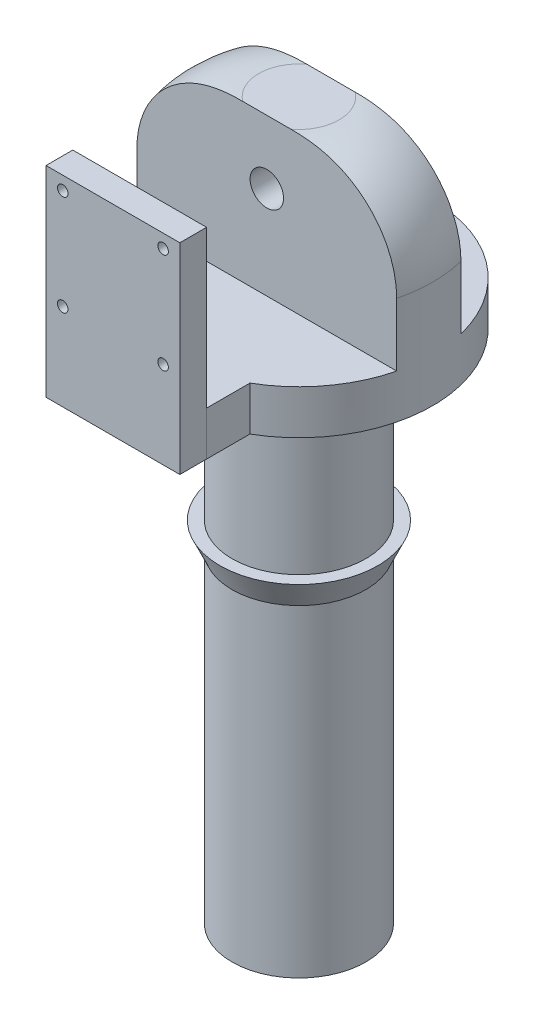
ISO-10303-21;
HEADER;
FILE_DESCRIPTION(('STEP AP214'),'2;1');
FILE_NAME('part.step','',(''),(''),'','','');
FILE_SCHEMA(('AUTOMOTIVE_DESIGN { 1 0 10303 214 1 1 1 1 }'));
ENDSEC;
DATA;
#1=APPLICATION_CONTEXT('core data for automotive mechanical design processes');
#2=APPLICATION_PROTOCOL_DEFINITION('international standard','automotive_design',2000,#1);
#3=PRODUCT_CONTEXT('',#1,'mechanical');
#4=PRODUCT('Part','Part','',(#3));
#5=PRODUCT_RELATED_PRODUCT_CATEGORY('part','',(#4));
#6=PRODUCT_DEFINITION_FORMATION('','',#4);
#7=PRODUCT_DEFINITION_CONTEXT('part definition',#1,'design');
#8=PRODUCT_DEFINITION('design','',#6,#7);
#9=PRODUCT_DEFINITION_SHAPE('','',#8);
#10=(LENGTH_UNIT() NAMED_UNIT(*) SI_UNIT(.MILLI.,.METRE.));
#11=(NAMED_UNIT(*) PLANE_ANGLE_UNIT() SI_UNIT($,.RADIAN.));
#12=(NAMED_UNIT(*) SI_UNIT($,.STERADIAN.) SOLID_ANGLE_UNIT());
#13=UNCERTAINTY_MEASURE_WITH_UNIT(LENGTH_MEASURE(1.E-05),#10,'distance_accuracy_value','');
#14=(GEOMETRIC_REPRESENTATION_CONTEXT(3) GLOBAL_UNCERTAINTY_ASSIGNED_CONTEXT((#13)) GLOBAL_UNIT_ASSIGNED_CONTEXT((#10,
#11,#12)) REPRESENTATION_CONTEXT('',''));
#15=CARTESIAN_POINT('',(0.,0.,0.));
#16=DIRECTION('',(0.,0.,1.));
#17=DIRECTION('',(1.,0.,0.));
#18=AXIS2_PLACEMENT_3D('',#15,#16,#17);
#19=CARTESIAN_POINT('',(8.66583083148983,71.8869808709486,30.226));
#20=DIRECTION('',(0.,0.,-1.));
#21=DIRECTION('',(-1.,0.,0.));
#22=AXIS2_PLACEMENT_3D('',#19,#20,#21);
#23=PLANE('',#22);
#24=CARTESIAN_POINT('',(9.525,133.35,30.226));
#25=DIRECTION('',(0.,0.,-1.));
#26=DIRECTION('',(-1.,0.,0.));
#27=AXIS2_PLACEMENT_3D('',#24,#25,#26);
#28=CIRCLE('',#27,1.);
#29=CARTESIAN_POINT('',(8.525,133.35,30.226));
#30=VERTEX_POINT('',#29);
#31=EDGE_CURVE('E140',#30,#30,#28,.T.);
#32=ORIENTED_EDGE('',*,*,#31,.F.);
#33=EDGE_LOOP('',(#32));
#34=FACE_BOUND('',#33,.T.);
#35=CARTESIAN_POINT('',(-9.525,114.3,30.226));
#36=DIRECTION('',(0.,0.,-1.));
#37=DIRECTION('',(-1.,0.,0.));
#38=AXIS2_PLACEMENT_3D('',#35,#36,#37);
#39=CIRCLE('',#38,1.);
#40=CARTESIAN_POINT('',(-10.525,114.3,30.226));
#41=VERTEX_POINT('',#40);
#42=EDGE_CURVE('E138',#41,#41,#39,.T.);
#43=ORIENTED_EDGE('',*,*,#42,.F.);
#44=EDGE_LOOP('',(#43));
#45=FACE_BOUND('',#44,.T.);
#46=CARTESIAN_POINT('',(-9.525,133.35,30.226));
#47=DIRECTION('',(0.,0.,-1.));
#48=DIRECTION('',(-1.,0.,0.));
#49=AXIS2_PLACEMENT_3D('',#46,#47,#48);
#50=CIRCLE('',#49,1.);
#51=CARTESIAN_POINT('',(-10.525,133.35,30.226));
#52=VERTEX_POINT('',#51);
#53=EDGE_CURVE('E148',#52,#52,#50,.T.);
#54=ORIENTED_EDGE('',*,*,#53,.F.);
#55=EDGE_LOOP('',(#54));
#56=FACE_BOUND('',#55,.T.);
#57=CARTESIAN_POINT('',(9.525,114.3,30.226));
#58=DIRECTION('',(0.,0.,-1.));
#59=DIRECTION('',(-1.,0.,0.));
#60=AXIS2_PLACEMENT_3D('',#57,#58,#59);
#61=CIRCLE('',#60,1.);
#62=CARTESIAN_POINT('',(8.525,114.3,30.226));
#63=VERTEX_POINT('',#62);
#64=EDGE_CURVE('E117',#63,#63,#61,.T.);
#65=ORIENTED_EDGE('',*,*,#64,.F.);
#66=EDGE_LOOP('',(#65));
#67=FACE_BOUND('',#66,.T.);
#68=DIRECTION('',(1.,0.,0.));
#69=VECTOR('',#68,1.);
#70=CARTESIAN_POINT('',(8.66583083148983,97.79,30.226));
#71=LINE('',#70,#69);
#72=CARTESIAN_POINT('',(-12.7,97.79,30.226));
#73=VERTEX_POINT('',#72);
#74=CARTESIAN_POINT('',(12.7,97.79,30.226));
#75=VERTEX_POINT('',#74);
#76=EDGE_CURVE('E67',#73,#75,#71,.T.);
#77=ORIENTED_EDGE('',*,*,#76,.F.);
#78=DIRECTION('',(0.,1.,0.));
#79=VECTOR('',#78,1.);
#80=CARTESIAN_POINT('',(-12.7,71.8869808709486,30.226));
#81=LINE('',#80,#79);
#82=CARTESIAN_POINT('',(-12.7,135.89,30.226));
#83=VERTEX_POINT('',#82);
#84=EDGE_CURVE('E93',#73,#83,#81,.T.);
#85=ORIENTED_EDGE('',*,*,#84,.T.);
#86=DIRECTION('',(-1.,0.,0.));
#87=VECTOR('',#86,1.);
#88=CARTESIAN_POINT('',(8.66583083148983,135.89,30.226));
#89=LINE('',#88,#87);
#90=CARTESIAN_POINT('',(12.7,135.89,30.226));
#91=VERTEX_POINT('',#90);
#92=EDGE_CURVE('E97',#91,#83,#89,.T.);
#93=ORIENTED_EDGE('',*,*,#92,.F.);
#94=DIRECTION('',(0.,1.,0.));
#95=VECTOR('',#94,1.);
#96=CARTESIAN_POINT('',(12.7,71.8869808709486,30.226));
#97=LINE('',#96,#95);
#98=EDGE_CURVE('E121',#75,#91,#97,.T.);
#99=ORIENTED_EDGE('',*,*,#98,.F.);
#100=EDGE_LOOP('',(#77,#85,#93,#99));
#101=FACE_BOUND('',#100,.T.);
#102=ADVANCED_FACE('F60',(#34,#45,#56,#67,#101),#23,.T.);
#103=CARTESIAN_POINT('',(12.7,71.8869808709486,30.226));
#104=DIRECTION('',(1.,0.,0.));
#105=DIRECTION('',(0.,0.,-1.));
#106=AXIS2_PLACEMENT_3D('',#103,#104,#105);
#107=PLANE('',#106);
#108=DIRECTION('',(0.,0.,1.));
#109=VECTOR('',#108,1.);
#110=CARTESIAN_POINT('',(12.7,97.79,30.226));
#111=LINE('',#110,#109);
#112=CARTESIAN_POINT('',(12.7,97.79,35.306));
#113=VERTEX_POINT('',#112);
#114=EDGE_CURVE('E71',#75,#113,#111,.T.);
#115=ORIENTED_EDGE('',*,*,#114,.F.);
#116=ORIENTED_EDGE('',*,*,#98,.T.);
#117=DIRECTION('',(0.,0.,-1.));
#118=VECTOR('',#117,1.);
#119=CARTESIAN_POINT('',(12.7,135.89,30.226));
#120=LINE('',#119,#118);
#121=CARTESIAN_POINT('',(12.7,135.89,35.306));
#122=VERTEX_POINT('',#121);
#123=EDGE_CURVE('E107',#122,#91,#120,.T.);
#124=ORIENTED_EDGE('',*,*,#123,.F.);
#125=DIRECTION('',(0.,1.,0.));
#126=VECTOR('',#125,1.);
#127=CARTESIAN_POINT('',(12.7,71.8869808709486,35.306));
#128=LINE('',#127,#126);
#129=EDGE_CURVE('E130',#113,#122,#128,.T.);
#130=ORIENTED_EDGE('',*,*,#129,.F.);
#131=EDGE_LOOP('',(#115,#116,#124,#130));
#132=FACE_BOUND('',#131,.T.);
#133=ADVANCED_FACE('F134',(#132),#107,.T.);
#134=CARTESIAN_POINT('',(12.7,71.8869808709486,35.306));
#135=DIRECTION('',(0.,0.,1.));
#136=DIRECTION('',(1.,0.,0.));
#137=AXIS2_PLACEMENT_3D('',#134,#135,#136);
#138=PLANE('',#137);
#139=CARTESIAN_POINT('',(9.525,133.35,35.306));
#140=DIRECTION('',(0.,0.,1.));
#141=DIRECTION('',(1.,0.,0.));
#142=AXIS2_PLACEMENT_3D('',#139,#140,#141);
#143=CIRCLE('',#142,1.);
#144=CARTESIAN_POINT('',(10.525,133.35,35.306));
#145=VERTEX_POINT('',#144);
#146=EDGE_CURVE('E145',#145,#145,#143,.F.);
#147=ORIENTED_EDGE('',*,*,#146,.T.);
#148=EDGE_LOOP('',(#147));
#149=FACE_BOUND('',#148,.T.);
#150=CARTESIAN_POINT('',(-9.525,114.3,35.306));
#151=DIRECTION('',(0.,0.,1.));
#152=DIRECTION('',(1.,0.,0.));
#153=AXIS2_PLACEMENT_3D('',#150,#151,#152);
#154=CIRCLE('',#153,1.);
#155=CARTESIAN_POINT('',(-8.525,114.3,35.306));
#156=VERTEX_POINT('',#155);
#157=EDGE_CURVE('E141',#156,#156,#154,.F.);
#158=ORIENTED_EDGE('',*,*,#157,.T.);
#159=EDGE_LOOP('',(#158));
#160=FACE_BOUND('',#159,.T.);
#161=CARTESIAN_POINT('',(-9.525,133.35,35.306));
#162=DIRECTION('',(0.,0.,1.));
#163=DIRECTION('',(1.,0.,0.));
#164=AXIS2_PLACEMENT_3D('',#161,#162,#163);
#165=CIRCLE('',#164,1.);
#166=CARTESIAN_POINT('',(-8.525,133.35,35.306));
#167=VERTEX_POINT('',#166);
#168=EDGE_CURVE('E154',#167,#167,#165,.F.);
#169=ORIENTED_EDGE('',*,*,#168,.T.);
#170=EDGE_LOOP('',(#169));
#171=FACE_BOUND('',#170,.T.);
#172=CARTESIAN_POINT('',(9.525,114.3,35.306));
#173=DIRECTION('',(0.,0.,1.));
#174=DIRECTION('',(1.,0.,0.));
#175=AXIS2_PLACEMENT_3D('',#172,#173,#174);
#176=CIRCLE('',#175,1.);
#177=CARTESIAN_POINT('',(10.525,114.3,35.306));
#178=VERTEX_POINT('',#177);
#179=EDGE_CURVE('E112',#178,#178,#176,.F.);
#180=ORIENTED_EDGE('',*,*,#179,.T.);
#181=EDGE_LOOP('',(#180));
#182=FACE_BOUND('',#181,.T.);
#183=DIRECTION('',(-1.,0.,0.));
#184=VECTOR('',#183,1.);
#185=CARTESIAN_POINT('',(12.7,97.79,35.306));
#186=LINE('',#185,#184);
#187=CARTESIAN_POINT('',(-12.7,97.79,35.306));
#188=VERTEX_POINT('',#187);
#189=EDGE_CURVE('E128',#113,#188,#186,.T.);
#190=ORIENTED_EDGE('',*,*,#189,.F.);
#191=ORIENTED_EDGE('',*,*,#129,.T.);
#192=DIRECTION('',(1.,0.,0.));
#193=VECTOR('',#192,1.);
#194=CARTESIAN_POINT('',(12.7,135.89,35.306));
#195=LINE('',#194,#193);
#196=CARTESIAN_POINT('',(-12.7,135.89,35.306));
#197=VERTEX_POINT('',#196);
#198=EDGE_CURVE('E113',#197,#122,#195,.T.);
#199=ORIENTED_EDGE('',*,*,#198,.F.);
#200=DIRECTION('',(0.,1.,0.));
#201=VECTOR('',#200,1.);
#202=CARTESIAN_POINT('',(-12.7,71.8869808709486,35.306));
#203=LINE('',#202,#201);
#204=EDGE_CURVE('E103',#188,#197,#203,.T.);
#205=ORIENTED_EDGE('',*,*,#204,.F.);
#206=EDGE_LOOP('',(#190,#191,#199,#205));
#207=FACE_BOUND('',#206,.T.);
#208=ADVANCED_FACE('F132',(#149,#160,#171,#182,#207),#138,.T.);
#209=CARTESIAN_POINT('',(-12.7,71.8869808709486,35.306));
#210=DIRECTION('',(-1.,0.,0.));
#211=DIRECTION('',(0.,0.,1.));
#212=AXIS2_PLACEMENT_3D('',#209,#210,#211);
#213=PLANE('',#212);
#214=DIRECTION('',(0.,0.,-1.));
#215=VECTOR('',#214,1.);
#216=CARTESIAN_POINT('',(-12.7,97.79,35.306));
#217=LINE('',#216,#215);
#218=EDGE_CURVE('E12',#188,#73,#217,.T.);
#219=ORIENTED_EDGE('',*,*,#218,.F.);
#220=ORIENTED_EDGE('',*,*,#204,.T.);
#221=DIRECTION('',(0.,0.,1.));
#222=VECTOR('',#221,1.);
#223=CARTESIAN_POINT('',(-12.7,135.89,35.306));
#224=LINE('',#223,#222);
#225=EDGE_CURVE('E110',#83,#197,#224,.T.);
#226=ORIENTED_EDGE('',*,*,#225,.F.);
#227=ORIENTED_EDGE('',*,*,#84,.F.);
#228=EDGE_LOOP('',(#219,#220,#226,#227));
#229=FACE_BOUND('',#228,.T.);
#230=ADVANCED_FACE('F56',(#229),#213,.T.);
#231=CARTESIAN_POINT('',(0.,135.89,0.));
#232=DIRECTION('',(0.,-1.,0.));
#233=DIRECTION('',(0.,0.,-1.));
#234=AXIS2_PLACEMENT_3D('',#231,#232,#233);
#235=PLANE('',#234);
#236=ORIENTED_EDGE('',*,*,#92,.T.);
#237=ORIENTED_EDGE('',*,*,#225,.T.);
#238=ORIENTED_EDGE('',*,*,#198,.T.);
#239=ORIENTED_EDGE('',*,*,#123,.T.);
#240=EDGE_LOOP('',(#236,#237,#238,#239));
#241=FACE_BOUND('',#240,.T.);
#242=ADVANCED_FACE('F102',(#241),#235,.F.);
#243=CARTESIAN_POINT('',(0.,97.79,0.));
#244=DIRECTION('',(0.,1.,0.));
#245=DIRECTION('',(0.,0.,1.));
#246=AXIS2_PLACEMENT_3D('',#243,#244,#245);
#247=PLANE('',#246);
#248=ORIENTED_EDGE('',*,*,#76,.T.);
#249=ORIENTED_EDGE('',*,*,#114,.T.);
#250=ORIENTED_EDGE('',*,*,#189,.T.);
#251=ORIENTED_EDGE('',*,*,#218,.T.);
#252=EDGE_LOOP('',(#248,#249,#250,#251));
#253=FACE_BOUND('',#252,.T.);
#254=ADVANCED_FACE('F175',(#253),#247,.F.);
#255=CARTESIAN_POINT('',(9.525,114.3,38.1344271247462));
#256=DIRECTION('',(0.,0.,-1.));
#257=DIRECTION('',(-1.,0.,0.));
#258=AXIS2_PLACEMENT_3D('',#255,#256,#257);
#259=CYLINDRICAL_SURFACE('',#258,1.);
#260=ORIENTED_EDGE('',*,*,#64,.T.);
#261=EDGE_LOOP('',(#260));
#262=FACE_BOUND('',#261,.T.);
#263=ORIENTED_EDGE('',*,*,#179,.F.);
#264=EDGE_LOOP('',(#263));
#265=FACE_BOUND('',#264,.T.);
#266=ADVANCED_FACE('F162',(#262,#265),#259,.F.);
#267=CARTESIAN_POINT('',(-9.525,133.35,38.1344271247462));
#268=DIRECTION('',(0.,0.,-1.));
#269=DIRECTION('',(-1.,0.,0.));
#270=AXIS2_PLACEMENT_3D('',#267,#268,#269);
#271=CYLINDRICAL_SURFACE('',#270,1.);
#272=ORIENTED_EDGE('',*,*,#53,.T.);
#273=EDGE_LOOP('',(#272));
#274=FACE_BOUND('',#273,.T.);
#275=ORIENTED_EDGE('',*,*,#168,.F.);
#276=EDGE_LOOP('',(#275));
#277=FACE_BOUND('',#276,.T.);
#278=ADVANCED_FACE('F158',(#274,#277),#271,.F.);
#279=CARTESIAN_POINT('',(-9.525,114.3,38.1344271247462));
#280=DIRECTION('',(0.,0.,-1.));
#281=DIRECTION('',(-1.,0.,0.));
#282=AXIS2_PLACEMENT_3D('',#279,#280,#281);
#283=CYLINDRICAL_SURFACE('',#282,1.);
#284=ORIENTED_EDGE('',*,*,#42,.T.);
#285=EDGE_LOOP('',(#284));
#286=FACE_BOUND('',#285,.T.);
#287=ORIENTED_EDGE('',*,*,#157,.F.);
#288=EDGE_LOOP('',(#287));
#289=FACE_BOUND('',#288,.T.);
#290=ADVANCED_FACE('F163',(#286,#289),#283,.F.);
#291=CARTESIAN_POINT('',(9.525,133.35,38.1344271247462));
#292=DIRECTION('',(0.,0.,-1.));
#293=DIRECTION('',(-1.,0.,0.));
#294=AXIS2_PLACEMENT_3D('',#291,#292,#293);
#295=CYLINDRICAL_SURFACE('',#294,1.);
#296=ORIENTED_EDGE('',*,*,#31,.T.);
#297=EDGE_LOOP('',(#296));
#298=FACE_BOUND('',#297,.T.);
#299=ORIENTED_EDGE('',*,*,#146,.F.);
#300=EDGE_LOOP('',(#299));
#301=FACE_BOUND('',#300,.T.);
#302=ADVANCED_FACE('F169',(#298,#301),#295,.F.);
#303=CLOSED_SHELL('',(#102,#133,#208,#230,#242,#254,#266,#278,#290,#302));
#304=MANIFOLD_SOLID_BREP('B2',#303);
#305=CARTESIAN_POINT('',(0.,135.89,0.));
#306=DIRECTION('',(0.,-1.,0.));
#307=DIRECTION('',(0.,0.,-1.));
#308=AXIS2_PLACEMENT_3D('',#305,#306,#307);
#309=CYLINDRICAL_SURFACE('',#308,25.4);
#310=CARTESIAN_POINT('',(0.,97.79,0.));
#311=DIRECTION('',(0.,1.,0.));
#312=DIRECTION('',(0.,0.,1.));
#313=AXIS2_PLACEMENT_3D('',#310,#311,#312);
#314=CIRCLE('',#313,25.4);
#315=CARTESIAN_POINT('',(12.7,97.79,21.9970452561247));
#316=VERTEX_POINT('',#315);
#317=CARTESIAN_POINT('',(-12.7,97.79,21.9970452561247));
#318=VERTEX_POINT('',#317);
#319=EDGE_CURVE('E291',#316,#318,#314,.T.);
#320=ORIENTED_EDGE('',*,*,#319,.T.);
#321=DIRECTION('',(0.,1.,0.));
#322=VECTOR('',#321,1.);
#323=CARTESIAN_POINT('',(-12.7,71.0902678632023,21.9970452561247));
#324=LINE('',#323,#322);
#325=CARTESIAN_POINT('',(-12.7,106.172,21.9970452561247));
#326=VERTEX_POINT('',#325);
#327=EDGE_CURVE('E369',#318,#326,#324,.T.);
#328=ORIENTED_EDGE('',*,*,#327,.T.);
#329=CARTESIAN_POINT('',(0.,106.172,0.));
#330=DIRECTION('',(0.,-1.,0.));
#331=DIRECTION('',(0.,0.,-1.));
#332=AXIS2_PLACEMENT_3D('',#329,#330,#331);
#333=CIRCLE('',#332,25.4);
#334=CARTESIAN_POINT('',(-24.6576313542076,106.172,6.096));
#335=VERTEX_POINT('',#334);
#336=EDGE_CURVE('E360',#326,#335,#333,.T.);
#337=ORIENTED_EDGE('',*,*,#336,.T.);
#338=DIRECTION('',(0.,-1.,0.));
#339=VECTOR('',#338,1.);
#340=CARTESIAN_POINT('',(-24.6576313542076,135.89,6.096));
#341=LINE('',#340,#339);
#342=CARTESIAN_POINT('',(-24.6576313542076,118.11,6.096));
#343=VERTEX_POINT('',#342);
#344=EDGE_CURVE('E425',#343,#335,#341,.T.);
#345=ORIENTED_EDGE('',*,*,#344,.F.);
#346=CARTESIAN_POINT('',(0.,118.11,0.));
#347=DIRECTION('',(0.,1.,0.));
#348=DIRECTION('',(0.,0.,1.));
#349=AXIS2_PLACEMENT_3D('',#346,#347,#348);
#350=CIRCLE('',#349,25.4);
#351=CARTESIAN_POINT('',(-24.6576313542076,118.11,-6.096));
#352=VERTEX_POINT('',#351);
#353=EDGE_CURVE('E533',#343,#352,#350,.F.);
#354=ORIENTED_EDGE('',*,*,#353,.T.);
#355=DIRECTION('',(0.,-1.,0.));
#356=VECTOR('',#355,1.);
#357=CARTESIAN_POINT('',(-24.6576313542076,135.89,-6.096));
#358=LINE('',#357,#356);
#359=CARTESIAN_POINT('',(-24.6576313542076,106.172,-6.096));
#360=VERTEX_POINT('',#359);
#361=EDGE_CURVE('E435',#352,#360,#358,.T.);
#362=ORIENTED_EDGE('',*,*,#361,.T.);
#363=CARTESIAN_POINT('',(0.,106.172,0.));
#364=DIRECTION('',(0.,1.,0.));
#365=DIRECTION('',(0.,0.,1.));
#366=AXIS2_PLACEMENT_3D('',#363,#364,#365);
#367=CIRCLE('',#366,25.4);
#368=CARTESIAN_POINT('',(24.6576313542076,106.172,-6.096));
#369=VERTEX_POINT('',#368);
#370=EDGE_CURVE('E356',#369,#360,#367,.T.);
#371=ORIENTED_EDGE('',*,*,#370,.F.);
#372=DIRECTION('',(0.,-1.,0.));
#373=VECTOR('',#372,1.);
#374=CARTESIAN_POINT('',(24.6576313542076,135.89,-6.096));
#375=LINE('',#374,#373);
#376=CARTESIAN_POINT('',(24.6576313542076,118.11,-6.096));
#377=VERTEX_POINT('',#376);
#378=EDGE_CURVE('E426',#369,#377,#375,.F.);
#379=ORIENTED_EDGE('',*,*,#378,.T.);
#380=CARTESIAN_POINT('',(0.,118.11,0.));
#381=DIRECTION('',(0.,1.,0.));
#382=DIRECTION('',(0.,0.,1.));
#383=AXIS2_PLACEMENT_3D('',#380,#381,#382);
#384=CIRCLE('',#383,25.4);
#385=CARTESIAN_POINT('',(24.6576313542076,118.11,6.096));
#386=VERTEX_POINT('',#385);
#387=EDGE_CURVE('E541',#377,#386,#384,.F.);
#388=ORIENTED_EDGE('',*,*,#387,.T.);
#389=DIRECTION('',(0.,-1.,0.));
#390=VECTOR('',#389,1.);
#391=CARTESIAN_POINT('',(24.6576313542076,135.89,6.096));
#392=LINE('',#391,#390);
#393=CARTESIAN_POINT('',(24.6576313542076,106.172,6.096));
#394=VERTEX_POINT('',#393);
#395=EDGE_CURVE('E351',#394,#386,#392,.F.);
#396=ORIENTED_EDGE('',*,*,#395,.F.);
#397=CARTESIAN_POINT('',(12.7,106.172,21.9970452561247));
#398=VERTEX_POINT('',#397);
#399=EDGE_CURVE('E348',#394,#398,#333,.T.);
#400=ORIENTED_EDGE('',*,*,#399,.T.);
#401=DIRECTION('',(0.,1.,0.));
#402=VECTOR('',#401,1.);
#403=CARTESIAN_POINT('',(12.7,71.0902678632023,21.9970452561247));
#404=LINE('',#403,#402);
#405=EDGE_CURVE('E296',#316,#398,#404,.T.);
#406=ORIENTED_EDGE('',*,*,#405,.F.);
#407=EDGE_LOOP('',(#320,#328,#337,#345,#354,#362,#371,#379,#388,#396,#400,#406));
#408=FACE_BOUND('',#407,.T.);
#409=ADVANCED_FACE('F272',(#408),#309,.T.);
#410=CARTESIAN_POINT('',(0.,135.89,0.));
#411=DIRECTION('',(0.,1.,0.));
#412=DIRECTION('',(0.,0.,1.));
#413=AXIS2_PLACEMENT_3D('',#410,#411,#412);
#414=PLANE('',#413);
#415=DIRECTION('',(1.,0.,0.));
#416=VECTOR('',#415,1.);
#417=CARTESIAN_POINT('',(-25.4,135.89,-6.096));
#418=LINE('',#417,#416);
#419=CARTESIAN_POINT('',(-4.572,135.89,-6.096));
#420=VERTEX_POINT('',#419);
#421=CARTESIAN_POINT('',(4.572,135.89,-6.096));
#422=VERTEX_POINT('',#421);
#423=EDGE_CURVE('E412',#420,#422,#418,.T.);
#424=ORIENTED_EDGE('',*,*,#423,.F.);
#425=CARTESIAN_POINT('',(0.,135.89,0.));
#426=DIRECTION('',(0.,1.,0.));
#427=DIRECTION('',(0.,0.,1.));
#428=AXIS2_PLACEMENT_3D('',#425,#426,#427);
#429=CIRCLE('',#428,7.62);
#430=CARTESIAN_POINT('',(-4.572,135.89,6.096));
#431=VERTEX_POINT('',#430);
#432=EDGE_CURVE('E465',#420,#431,#429,.T.);
#433=ORIENTED_EDGE('',*,*,#432,.T.);
#434=DIRECTION('',(1.,0.,0.));
#435=VECTOR('',#434,1.);
#436=CARTESIAN_POINT('',(-25.4,135.89,6.096));
#437=LINE('',#436,#435);
#438=CARTESIAN_POINT('',(4.572,135.89,6.096));
#439=VERTEX_POINT('',#438);
#440=EDGE_CURVE('E413',#431,#439,#437,.T.);
#441=ORIENTED_EDGE('',*,*,#440,.T.);
#442=CARTESIAN_POINT('',(0.,135.89,0.));
#443=DIRECTION('',(0.,1.,0.));
#444=DIRECTION('',(0.,0.,1.));
#445=AXIS2_PLACEMENT_3D('',#442,#443,#444);
#446=CIRCLE('',#445,7.62);
#447=EDGE_CURVE('E456',#439,#422,#446,.T.);
#448=ORIENTED_EDGE('',*,*,#447,.T.);
#449=EDGE_LOOP('',(#424,#433,#441,#448));
#450=FACE_BOUND('',#449,.T.);
#451=ADVANCED_FACE('F490',(#450),#414,.T.);
#452=CARTESIAN_POINT('',(0.,97.79,0.));
#453=DIRECTION('',(0.,-1.,0.));
#454=DIRECTION('',(0.,0.,-1.));
#455=AXIS2_PLACEMENT_3D('',#452,#453,#454);
#456=CYLINDRICAL_SURFACE('',#455,12.7);
#457=CARTESIAN_POINT('',(0.,61.214,0.));
#458=DIRECTION('',(0.,1.,0.));
#459=DIRECTION('',(0.,0.,1.));
#460=AXIS2_PLACEMENT_3D('',#457,#458,#459);
#461=CIRCLE('',#460,12.7);
#462=CARTESIAN_POINT('',(0.,61.214,12.7));
#463=VERTEX_POINT('',#462);
#464=EDGE_CURVE('E444',#463,#463,#461,.T.);
#465=ORIENTED_EDGE('',*,*,#464,.F.);
#466=EDGE_LOOP('',(#465));
#467=FACE_BOUND('',#466,.T.);
#468=CARTESIAN_POINT('',(0.,0.,0.));
#469=DIRECTION('',(0.,1.,0.));
#470=DIRECTION('',(0.,0.,1.));
#471=AXIS2_PLACEMENT_3D('',#468,#469,#470);
#472=CIRCLE('',#471,12.7);
#473=CARTESIAN_POINT('',(0.,0.,12.7));
#474=VERTEX_POINT('',#473);
#475=EDGE_CURVE('E446',#474,#474,#472,.T.);
#476=ORIENTED_EDGE('',*,*,#475,.T.);
#477=EDGE_LOOP('',(#476));
#478=FACE_BOUND('',#477,.T.);
#479=ADVANCED_FACE('F491',(#467,#478),#456,.T.);
#480=CARTESIAN_POINT('',(0.,0.,0.));
#481=DIRECTION('',(0.,1.,0.));
#482=DIRECTION('',(0.,0.,1.));
#483=AXIS2_PLACEMENT_3D('',#480,#481,#482);
#484=PLANE('',#483);
#485=ORIENTED_EDGE('',*,*,#475,.F.);
#486=EDGE_LOOP('',(#485));
#487=FACE_BOUND('',#486,.T.);
#488=ADVANCED_FACE('F508',(#487),#484,.F.);
#489=CARTESIAN_POINT('',(0.,66.294,0.));
#490=DIRECTION('',(0.,1.,0.));
#491=DIRECTION('',(0.,0.,1.));
#492=AXIS2_PLACEMENT_3D('',#489,#490,#491);
#493=CONICAL_SURFACE('',#492,14.986,0.42285392613294);
#494=ORIENTED_EDGE('',*,*,#464,.T.);
#495=EDGE_LOOP('',(#494));
#496=FACE_BOUND('',#495,.T.);
#497=CARTESIAN_POINT('',(0.,66.294,0.));
#498=DIRECTION('',(0.,1.,0.));
#499=DIRECTION('',(0.,0.,1.));
#500=AXIS2_PLACEMENT_3D('',#497,#498,#499);
#501=CIRCLE('',#500,14.986);
#502=CARTESIAN_POINT('',(0.,66.294,14.986));
#503=VERTEX_POINT('',#502);
#504=EDGE_CURVE('E441',#503,#503,#501,.T.);
#505=ORIENTED_EDGE('',*,*,#504,.F.);
#506=EDGE_LOOP('',(#505));
#507=FACE_BOUND('',#506,.T.);
#508=ADVANCED_FACE('F504',(#496,#507),#493,.T.);
#509=CARTESIAN_POINT('',(0.,66.294,0.));
#510=DIRECTION('',(0.,1.,0.));
#511=DIRECTION('',(0.,0.,1.));
#512=AXIS2_PLACEMENT_3D('',#509,#510,#511);
#513=PLANE('',#512);
#514=ORIENTED_EDGE('',*,*,#504,.T.);
#515=EDGE_LOOP('',(#514));
#516=FACE_BOUND('',#515,.T.);
#517=CARTESIAN_POINT('',(0.,66.294,0.));
#518=DIRECTION('',(0.,1.,0.));
#519=DIRECTION('',(0.,0.,1.));
#520=AXIS2_PLACEMENT_3D('',#517,#518,#519);
#521=CIRCLE('',#520,12.7);
#522=CARTESIAN_POINT('',(0.,66.294,12.7));
#523=VERTEX_POINT('',#522);
#524=EDGE_CURVE('E440',#523,#523,#521,.T.);
#525=ORIENTED_EDGE('',*,*,#524,.F.);
#526=EDGE_LOOP('',(#525));
#527=FACE_BOUND('',#526,.T.);
#528=ADVANCED_FACE('F505',(#516,#527),#513,.T.);
#529=ORIENTED_EDGE('',*,*,#524,.T.);
#530=EDGE_LOOP('',(#529));
#531=FACE_BOUND('',#530,.T.);
#532=CARTESIAN_POINT('',(0.,97.79,0.));
#533=DIRECTION('',(0.,1.,0.));
#534=DIRECTION('',(0.,0.,1.));
#535=AXIS2_PLACEMENT_3D('',#532,#533,#534);
#536=CIRCLE('',#535,12.7);
#537=CARTESIAN_POINT('',(0.,97.79,12.7));
#538=VERTEX_POINT('',#537);
#539=EDGE_CURVE('E423',#538,#538,#536,.T.);
#540=ORIENTED_EDGE('',*,*,#539,.F.);
#541=EDGE_LOOP('',(#540));
#542=FACE_BOUND('',#541,.T.);
#543=ADVANCED_FACE('F498',(#531,#542),#456,.T.);
#544=CARTESIAN_POINT('',(0.,97.79,0.));
#545=DIRECTION('',(0.,1.,0.));
#546=DIRECTION('',(0.,0.,1.));
#547=AXIS2_PLACEMENT_3D('',#544,#545,#546);
#548=PLANE('',#547);
#549=ORIENTED_EDGE('',*,*,#539,.T.);
#550=EDGE_LOOP('',(#549));
#551=FACE_BOUND('',#550,.T.);
#552=ORIENTED_EDGE('',*,*,#319,.F.);
#553=DIRECTION('',(0.,0.,1.));
#554=VECTOR('',#553,1.);
#555=CARTESIAN_POINT('',(12.7,97.79,23.876));
#556=LINE('',#555,#554);
#557=CARTESIAN_POINT('',(12.7,97.79,30.226));
#558=VERTEX_POINT('',#557);
#559=EDGE_CURVE('E368',#316,#558,#556,.T.);
#560=ORIENTED_EDGE('',*,*,#559,.T.);
#561=DIRECTION('',(-1.,0.,0.));
#562=VECTOR('',#561,1.);
#563=CARTESIAN_POINT('',(-12.7,97.79,30.226));
#564=LINE('',#563,#562);
#565=CARTESIAN_POINT('',(-12.7,97.79,30.226));
#566=VERTEX_POINT('',#565);
#567=EDGE_CURVE('E385',#558,#566,#564,.T.);
#568=ORIENTED_EDGE('',*,*,#567,.T.);
#569=DIRECTION('',(0.,0.,-1.));
#570=VECTOR('',#569,1.);
#571=CARTESIAN_POINT('',(-12.7,97.79,23.876));
#572=LINE('',#571,#570);
#573=EDGE_CURVE('E387',#566,#318,#572,.T.);
#574=ORIENTED_EDGE('',*,*,#573,.T.);
#575=EDGE_LOOP('',(#552,#560,#568,#574));
#576=FACE_BOUND('',#575,.T.);
#577=ADVANCED_FACE('F492',(#551,#576),#548,.F.);
#578=CARTESIAN_POINT('',(-25.4,106.172,0.));
#579=DIRECTION('',(0.,-1.,0.));
#580=DIRECTION('',(0.,0.,-1.));
#581=AXIS2_PLACEMENT_3D('',#578,#579,#580);
#582=PLANE('',#581);
#583=DIRECTION('',(1.,0.,0.));
#584=VECTOR('',#583,1.);
#585=CARTESIAN_POINT('',(-25.4,106.172,6.096));
#586=LINE('',#585,#584);
#587=EDGE_CURVE('E408',#335,#394,#586,.T.);
#588=ORIENTED_EDGE('',*,*,#587,.F.);
#589=ORIENTED_EDGE('',*,*,#336,.F.);
#590=DIRECTION('',(0.,0.,1.));
#591=VECTOR('',#590,1.);
#592=CARTESIAN_POINT('',(-12.7,106.172,23.876));
#593=LINE('',#592,#591);
#594=CARTESIAN_POINT('',(-12.7,106.172,30.226));
#595=VERTEX_POINT('',#594);
#596=EDGE_CURVE('E380',#326,#595,#593,.T.);
#597=ORIENTED_EDGE('',*,*,#596,.T.);
#598=DIRECTION('',(1.,0.,0.));
#599=VECTOR('',#598,1.);
#600=CARTESIAN_POINT('',(-12.7,106.172,30.226));
#601=LINE('',#600,#599);
#602=CARTESIAN_POINT('',(12.7,106.172,30.226));
#603=VERTEX_POINT('',#602);
#604=EDGE_CURVE('E371',#595,#603,#601,.T.);
#605=ORIENTED_EDGE('',*,*,#604,.T.);
#606=DIRECTION('',(0.,0.,-1.));
#607=VECTOR('',#606,1.);
#608=CARTESIAN_POINT('',(12.7,106.172,23.876));
#609=LINE('',#608,#607);
#610=EDGE_CURVE('E366',#603,#398,#609,.T.);
#611=ORIENTED_EDGE('',*,*,#610,.T.);
#612=ORIENTED_EDGE('',*,*,#399,.F.);
#613=EDGE_LOOP('',(#588,#589,#597,#605,#611,#612));
#614=FACE_BOUND('',#613,.T.);
#615=ADVANCED_FACE('F373',(#614),#582,.F.);
#616=CARTESIAN_POINT('',(-25.4,0.,6.09599999999998));
#617=DIRECTION('',(0.,0.,1.));
#618=DIRECTION('',(0.,-1.,0.));
#619=AXIS2_PLACEMENT_3D('',#616,#617,#618);
#620=PLANE('',#619);
#621=CARTESIAN_POINT('',(0.,123.825,6.096));
#622=DIRECTION('',(0.,0.,1.));
#623=DIRECTION('',(0.,-1.,0.));
#624=AXIS2_PLACEMENT_3D('',#621,#622,#623);
#625=CIRCLE('',#624,3.175);
#626=CARTESIAN_POINT('',(0.,120.65,6.096));
#627=VERTEX_POINT('',#626);
#628=EDGE_CURVE('E405',#627,#627,#625,.F.);
#629=ORIENTED_EDGE('',*,*,#628,.T.);
#630=EDGE_LOOP('',(#629));
#631=FACE_BOUND('',#630,.T.);
#632=ORIENTED_EDGE('',*,*,#440,.F.);
#633=CARTESIAN_POINT('',(-4.572,135.89,6.096));
#634=CARTESIAN_POINT('',(-4.73221962757965,135.890003572415,6.096));
#635=CARTESIAN_POINT('',(-4.89243988172524,135.889219893008,6.096));
#636=CARTESIAN_POINT('',(-5.21286800589376,135.885794035056,6.096));
#637=CARTESIAN_POINT('',(-5.37307587489268,135.883151763309,6.096));
#638=CARTESIAN_POINT('',(-5.85376166317445,135.87200821479,6.096));
#639=CARTESIAN_POINT('',(-6.17417637322918,135.860289756917,6.096));
#640=CARTESIAN_POINT('',(-6.81530914931248,135.826361554901,6.096));
#641=CARTESIAN_POINT('',(-7.13602580192154,135.804124337728,6.096));
#642=CARTESIAN_POINT('',(-7.77637727747322,135.747690206759,6.096));
#643=CARTESIAN_POINT('',(-8.09601224492534,135.71349495979,6.096));
#644=CARTESIAN_POINT('',(-8.73511523138546,135.631839471919,6.096));
#645=CARTESIAN_POINT('',(-9.05457550126635,135.584318035043,6.096));
#646=CARTESIAN_POINT('',(-9.69108901938256,135.475246424286,6.096));
#647=CARTESIAN_POINT('',(-10.0081423695814,135.413696848139,6.096));
#648=CARTESIAN_POINT('',(-10.638752981454,135.276042045905,6.096));
#649=CARTESIAN_POINT('',(-10.952313455149,135.199951606423,6.096));
#650=CARTESIAN_POINT('',(-11.5753843776746,135.032801618653,6.096));
#651=CARTESIAN_POINT('',(-11.8848950953581,134.941743069559,6.096));
#652=CARTESIAN_POINT('',(-12.6842587679039,134.684891367761,6.096));
#653=CARTESIAN_POINT('',(-13.1703363003012,134.507139485877,6.096));
#654=CARTESIAN_POINT('',(-14.1263418474449,134.112301125893,6.096));
#655=CARTESIAN_POINT('',(-14.5962667475511,133.895207111686,6.096));
#656=CARTESIAN_POINT('',(-15.5150216383782,133.422897042977,6.096));
#657=CARTESIAN_POINT('',(-15.9639040852428,133.167783229739,6.096));
#658=CARTESIAN_POINT('',(-16.8382607679193,132.620217020428,6.096));
#659=CARTESIAN_POINT('',(-17.2637365845327,132.327767150343,6.096));
#660=CARTESIAN_POINT('',(-18.0891326119244,131.706252554251,6.096));
#661=CARTESIAN_POINT('',(-18.4889701084489,131.377077869862,6.096));
#662=CARTESIAN_POINT('',(-19.2583462598229,130.685027597066,6.096));
#663=CARTESIAN_POINT('',(-19.6278836894102,130.322150647084,6.096));
#664=CARTESIAN_POINT('',(-20.3339840564899,129.564801718268,6.096));
#665=CARTESIAN_POINT('',(-20.6705122635274,129.170297239008,6.096));
#666=CARTESIAN_POINT('',(-21.1479790519846,128.557493466012,6.096));
#667=CARTESIAN_POINT('',(-21.3025844882526,128.349711358351,6.096));
#668=CARTESIAN_POINT('',(-21.6024514641991,127.927425767712,6.096));
#669=CARTESIAN_POINT('',(-21.7477105134642,127.712920515759,6.096));
#670=CARTESIAN_POINT('',(-22.1570867836563,127.07836282265,6.096));
#671=CARTESIAN_POINT('',(-22.4082991147849,126.649881898516,6.096));
#672=CARTESIAN_POINT('',(-22.873113975252,125.773055623343,6.096));
#673=CARTESIAN_POINT('',(-23.0867171555106,125.32471061627,6.096));
#674=CARTESIAN_POINT('',(-23.4745271015618,124.411757851051,6.096));
#675=CARTESIAN_POINT('',(-23.6487687153836,123.947164901955,6.096));
#676=CARTESIAN_POINT('',(-23.9567024725719,123.004805081354,6.096));
#677=CARTESIAN_POINT('',(-24.0904041739933,122.527041344136,6.096));
#678=CARTESIAN_POINT('',(-24.2787366385902,121.722226739497,6.096));
#679=CARTESIAN_POINT('',(-24.3448806221615,121.397820698095,6.096));
#680=CARTESIAN_POINT('',(-24.4584250240215,120.745749984143,6.096));
#681=CARTESIAN_POINT('',(-24.5058269116111,120.418085569101,6.096));
#682=CARTESIAN_POINT('',(-24.5816767878574,119.760931961043,6.096));
#683=CARTESIAN_POINT('',(-24.6101450710676,119.431445104818,6.096));
#684=CARTESIAN_POINT('',(-24.6481301059606,118.771306963853,6.096));
#685=CARTESIAN_POINT('',(-24.6576426141533,118.440655434979,6.096));
#686=CARTESIAN_POINT('',(-24.6576313542076,118.11,6.096));
#687=B_SPLINE_CURVE_WITH_KNOTS('',3,(#633,#634,#635,#636,#637,#638,#639,#640,#641,#642,#643,
#644,#645,#646,#647,#648,#649,#650,#651,#652,#653,#654,#655,#656,#657,#658,#659,#660,#661,#662,
#663,#664,#665,#666,#667,#668,#669,#670,#671,#672,#673,#674,#675,#676,#677,#678,#679,#680,#681,
#682,#683,#684,#685,#686),.UNSPECIFIED.,.F.,.F.,(4,2,2,2,2,2,2,2,2,2,2,2,2,2,2,2,2,2,2,2,2,2,2,
2,2,2,4),(0.,0.480656391765436,0.961336888165845,1.92307394877226,2.88733687402117,
3.85146544444734,4.82009606429664,5.788685418798,6.75629500605761,7.72384002692614,
9.2747189372438,10.8258952379078,12.3729730352671,13.9199462198425,15.4716822564927,
17.0234810107144,18.576895350592,19.3536476451994,20.1306060612852,21.6187224752067,
23.10681313103,24.5935811247659,26.0799983116288,27.0727423490689,28.0654085441437,
29.0570089978413,30.0488314089193),.UNSPECIFIED.);
#688=EDGE_CURVE('E472',#431,#343,#687,.T.);
#689=ORIENTED_EDGE('',*,*,#688,.T.);
#690=ORIENTED_EDGE('',*,*,#344,.T.);
#691=ORIENTED_EDGE('',*,*,#587,.T.);
#692=ORIENTED_EDGE('',*,*,#395,.T.);
#693=CARTESIAN_POINT('',(24.6576313542076,118.11,6.096));
#694=CARTESIAN_POINT('',(24.6576317771776,118.353498719179,6.096));
#695=CARTESIAN_POINT('',(24.6524780131826,118.596970148535,6.096));
#696=CARTESIAN_POINT('',(24.6318782741148,119.083469133334,6.096));
#697=CARTESIAN_POINT('',(24.616432639875,119.326496703209,6.096));
#698=CARTESIAN_POINT('',(24.55469295714,120.054220787664,6.096));
#699=CARTESIAN_POINT('',(24.4929961097639,120.537692712696,6.096));
#700=CARTESIAN_POINT('',(24.3290869890988,121.497013821496,6.096));
#701=CARTESIAN_POINT('',(24.2269320984856,121.972872812635,6.096));
#702=CARTESIAN_POINT('',(24.0439463223195,122.678802004754,6.096));
#703=CARTESIAN_POINT('',(23.9779886693958,122.912811779192,6.096));
#704=CARTESIAN_POINT('',(23.8362567130739,123.377904094131,6.096));
#705=CARTESIAN_POINT('',(23.7604799305626,123.608985879149,6.096));
#706=CARTESIAN_POINT('',(23.518611347638,124.297225424723,6.096));
#707=CARTESIAN_POINT('',(23.3379855412333,124.749361070859,6.096));
#708=CARTESIAN_POINT('',(22.9393718829113,125.636850886196,6.096));
#709=CARTESIAN_POINT('',(22.7213837753055,126.072204940528,6.096));
#710=CARTESIAN_POINT('',(22.3676343203739,126.710372083708,6.096));
#711=CARTESIAN_POINT('',(22.2452178842254,126.92067499964,6.096));
#712=CARTESIAN_POINT('',(21.9917191263497,127.335915846285,6.096));
#713=CARTESIAN_POINT('',(21.860639035295,127.540855139172,6.096));
#714=CARTESIAN_POINT('',(21.4546868419668,128.147212056485,6.096));
#715=CARTESIAN_POINT('',(21.1670808155029,128.540208390646,6.096));
#716=CARTESIAN_POINT('',(20.5586214886528,129.302832598111,6.096));
#717=CARTESIAN_POINT('',(20.237602844294,129.672328115496,6.096));
#718=CARTESIAN_POINT('',(19.5659297364296,130.383340081192,6.096));
#719=CARTESIAN_POINT('',(19.2152750772312,130.724856344721,6.096));
#720=CARTESIAN_POINT('',(18.4872520439039,131.377468418608,6.096));
#721=CARTESIAN_POINT('',(18.1099058099896,131.688588943214,6.096));
#722=CARTESIAN_POINT('',(17.3310324353171,132.278896683542,6.096));
#723=CARTESIAN_POINT('',(16.9295055450371,132.558084229958,6.096));
#724=CARTESIAN_POINT('',(16.0974883306391,133.087967379879,6.096));
#725=CARTESIAN_POINT('',(15.6665969748169,133.338033042081,6.096));
#726=CARTESIAN_POINT('',(14.7859412486539,133.802401877308,6.096));
#727=CARTESIAN_POINT('',(14.3361756061492,134.016702634847,6.096));
#728=CARTESIAN_POINT('',(13.42002685161,134.40938237493,6.096));
#729=CARTESIAN_POINT('',(12.9536075012923,134.587676594673,6.096));
#730=CARTESIAN_POINT('',(12.0084800741012,134.907718859497,6.096));
#731=CARTESIAN_POINT('',(11.5297741898504,135.049473376176,6.096));
#732=CARTESIAN_POINT('',(10.7822475280617,135.241148400379,6.096));
#733=CARTESIAN_POINT('',(10.5165590784678,135.303584412328,6.096));
#734=CARTESIAN_POINT('',(9.98295217565162,135.418047568546,6.096));
#735=CARTESIAN_POINT('',(9.71503383130003,135.470075217915,6.096));
#736=CARTESIAN_POINT('',(9.17726972727421,135.564105694662,6.096));
#737=CARTESIAN_POINT('',(8.90742280015423,135.606101805561,6.096));
#738=CARTESIAN_POINT('',(8.36642957865126,135.680505744222,6.096));
#739=CARTESIAN_POINT('',(8.09528334811038,135.712914038276,6.096));
#740=CARTESIAN_POINT('',(7.55348793354679,135.768623304918,6.096));
#741=CARTESIAN_POINT('',(7.28284347336455,135.791970671134,6.096));
#742=CARTESIAN_POINT('',(6.74096354030181,135.830582970242,6.096));
#743=CARTESIAN_POINT('',(6.46972801999391,135.845847228608,6.096));
#744=CARTESIAN_POINT('',(5.92742714943812,135.869232886578,6.096));
#745=CARTESIAN_POINT('',(5.65636230039478,135.877366447178,6.096));
#746=CARTESIAN_POINT('',(5.11418851656839,135.887769672079,6.096));
#747=CARTESIAN_POINT('',(4.8430796132117,135.890040911722,6.096));
#748=CARTESIAN_POINT('',(4.57200000000001,135.89,6.096));
#749=B_SPLINE_CURVE_WITH_KNOTS('',3,(#693,#694,#695,#696,#697,#698,#699,#700,#701,#702,#703,
#704,#705,#706,#707,#708,#709,#710,#711,#712,#713,#714,#715,#716,#717,#718,#719,#720,#721,#722,
#723,#724,#725,#726,#727,#728,#729,#730,#731,#732,#733,#734,#735,#736,#737,#738,#739,#740,#741,
#742,#743,#744,#745,#746,#747,#748),.UNSPECIFIED.,.F.,.F.,(4,2,2,2,2,2,2,2,2,2,2,2,2,2,2,2,2,2,
2,2,2,2,2,2,2,2,2,4),(0.,0.730387166639917,1.46075014644957,2.92107531376559,4.37933663976933,
5.10853022370504,5.83790827292392,7.29671474106696,8.75553119293475,9.48535584092537,
10.2149933040418,11.6741325665396,13.1408706879225,14.6076184952428,16.0731636130043,
17.5386935523617,19.0316105637305,20.5246283627562,22.0211209159004,23.5173482407154,
24.335948235014,25.154508494348,25.9736152827836,26.79268222834,27.6074982553557,
28.4223822670193,29.2358738219925,30.049146750122),.UNSPECIFIED.);
#750=EDGE_CURVE('E470',#386,#439,#749,.T.);
#751=ORIENTED_EDGE('',*,*,#750,.T.);
#752=EDGE_LOOP('',(#632,#689,#690,#691,#692,#751));
#753=FACE_BOUND('',#752,.T.);
#754=ADVANCED_FACE('F484',(#631,#753),#620,.T.);
#755=CARTESIAN_POINT('',(-25.4,106.172,0.));
#756=DIRECTION('',(0.,1.,0.));
#757=DIRECTION('',(0.,0.,1.));
#758=AXIS2_PLACEMENT_3D('',#755,#756,#757);
#759=PLANE('',#758);
#760=DIRECTION('',(1.,0.,0.));
#761=VECTOR('',#760,1.);
#762=CARTESIAN_POINT('',(-25.4,106.172,-6.096));
#763=LINE('',#762,#761);
#764=EDGE_CURVE('E410',#360,#369,#763,.T.);
#765=ORIENTED_EDGE('',*,*,#764,.T.);
#766=ORIENTED_EDGE('',*,*,#370,.T.);
#767=EDGE_LOOP('',(#765,#766));
#768=FACE_BOUND('',#767,.T.);
#769=ADVANCED_FACE('F488',(#768),#759,.T.);
#770=CARTESIAN_POINT('',(-25.4,0.,-6.09600000000002));
#771=DIRECTION('',(0.,0.,1.));
#772=DIRECTION('',(0.,-1.,0.));
#773=AXIS2_PLACEMENT_3D('',#770,#771,#772);
#774=PLANE('',#773);
#775=CARTESIAN_POINT('',(0.,123.825,-6.09599999999999));
#776=DIRECTION('',(0.,0.,-1.));
#777=DIRECTION('',(0.,1.,0.));
#778=AXIS2_PLACEMENT_3D('',#775,#776,#777);
#779=CIRCLE('',#778,3.175);
#780=CARTESIAN_POINT('',(0.,127.,-6.09599999999999));
#781=VERTEX_POINT('',#780);
#782=EDGE_CURVE('E400',#781,#781,#779,.T.);
#783=ORIENTED_EDGE('',*,*,#782,.F.);
#784=EDGE_LOOP('',(#783));
#785=FACE_BOUND('',#784,.T.);
#786=ORIENTED_EDGE('',*,*,#361,.F.);
#787=CARTESIAN_POINT('',(-24.6576313542076,118.11,-6.096));
#788=CARTESIAN_POINT('',(-24.6576317771776,118.353498719179,-6.096));
#789=CARTESIAN_POINT('',(-24.6524780131826,118.596970148535,-6.096));
#790=CARTESIAN_POINT('',(-24.6318782741148,119.083469133334,-6.096));
#791=CARTESIAN_POINT('',(-24.616432639875,119.326496703209,-6.096));
#792=CARTESIAN_POINT('',(-24.55469295714,120.054220787664,-6.096));
#793=CARTESIAN_POINT('',(-24.4929961097639,120.537692712696,-6.096));
#794=CARTESIAN_POINT('',(-24.3290869890988,121.497013821496,-6.096));
#795=CARTESIAN_POINT('',(-24.2269320984856,121.972872812635,-6.096));
#796=CARTESIAN_POINT('',(-24.0439463223195,122.678802004754,-6.096));
#797=CARTESIAN_POINT('',(-23.9779886693958,122.912811779192,-6.096));
#798=CARTESIAN_POINT('',(-23.8362567130739,123.377904094131,-6.096));
#799=CARTESIAN_POINT('',(-23.7604799305626,123.608985879149,-6.096));
#800=CARTESIAN_POINT('',(-23.518611347638,124.297225424723,-6.096));
#801=CARTESIAN_POINT('',(-23.3379855412333,124.749361070859,-6.096));
#802=CARTESIAN_POINT('',(-22.9393718829113,125.636850886196,-6.096));
#803=CARTESIAN_POINT('',(-22.7213837753055,126.072204940528,-6.096));
#804=CARTESIAN_POINT('',(-22.3676343203739,126.710372083708,-6.096));
#805=CARTESIAN_POINT('',(-22.2452178842254,126.92067499964,-6.096));
#806=CARTESIAN_POINT('',(-21.9917191263497,127.335915846285,-6.096));
#807=CARTESIAN_POINT('',(-21.860639035295,127.540855139172,-6.096));
#808=CARTESIAN_POINT('',(-21.4546868419668,128.147212056485,-6.096));
#809=CARTESIAN_POINT('',(-21.1670808155029,128.540208390646,-6.096));
#810=CARTESIAN_POINT('',(-20.5586214886528,129.302832598111,-6.096));
#811=CARTESIAN_POINT('',(-20.237602844294,129.672328115496,-6.096));
#812=CARTESIAN_POINT('',(-19.5659297364296,130.383340081192,-6.096));
#813=CARTESIAN_POINT('',(-19.2152750772312,130.724856344721,-6.096));
#814=CARTESIAN_POINT('',(-18.4872520439039,131.377468418608,-6.096));
#815=CARTESIAN_POINT('',(-18.1099058099896,131.688588943214,-6.096));
#816=CARTESIAN_POINT('',(-17.3310324353171,132.278896683542,-6.096));
#817=CARTESIAN_POINT('',(-16.9295055450371,132.558084229958,-6.096));
#818=CARTESIAN_POINT('',(-16.0974883306391,133.087967379879,-6.096));
#819=CARTESIAN_POINT('',(-15.6665969748169,133.338033042081,-6.096));
#820=CARTESIAN_POINT('',(-14.7859412486539,133.802401877308,-6.096));
#821=CARTESIAN_POINT('',(-14.3361756061492,134.016702634847,-6.096));
#822=CARTESIAN_POINT('',(-13.42002685161,134.40938237493,-6.096));
#823=CARTESIAN_POINT('',(-12.9536075012923,134.587676594673,-6.096));
#824=CARTESIAN_POINT('',(-12.0084800741012,134.907718859497,-6.096));
#825=CARTESIAN_POINT('',(-11.5297741898505,135.049473376176,-6.096));
#826=CARTESIAN_POINT('',(-10.7822475280617,135.241148400379,-6.096));
#827=CARTESIAN_POINT('',(-10.5165590784678,135.303584412328,-6.096));
#828=CARTESIAN_POINT('',(-9.98295217565162,135.418047568546,-6.096));
#829=CARTESIAN_POINT('',(-9.71503383130003,135.470075217915,-6.096));
#830=CARTESIAN_POINT('',(-9.17726972727421,135.564105694662,-6.096));
#831=CARTESIAN_POINT('',(-8.90742280015423,135.606101805561,-6.096));
#832=CARTESIAN_POINT('',(-8.36642957865126,135.680505744222,-6.096));
#833=CARTESIAN_POINT('',(-8.09528334811038,135.712914038276,-6.096));
#834=CARTESIAN_POINT('',(-7.55348793354679,135.768623304918,-6.096));
#835=CARTESIAN_POINT('',(-7.28284347336455,135.791970671134,-6.096));
#836=CARTESIAN_POINT('',(-6.74096354030181,135.830582970242,-6.096));
#837=CARTESIAN_POINT('',(-6.46972801999391,135.845847228608,-6.096));
#838=CARTESIAN_POINT('',(-5.92742714943812,135.869232886578,-6.096));
#839=CARTESIAN_POINT('',(-5.65636230039477,135.877366447178,-6.096));
#840=CARTESIAN_POINT('',(-5.11418851656839,135.887769672079,-6.096));
#841=CARTESIAN_POINT('',(-4.8430796132117,135.890040911722,-6.096));
#842=CARTESIAN_POINT('',(-4.57200000000001,135.89,-6.096));
#843=B_SPLINE_CURVE_WITH_KNOTS('',3,(#787,#788,#789,#790,#791,#792,#793,#794,#795,#796,#797,
#798,#799,#800,#801,#802,#803,#804,#805,#806,#807,#808,#809,#810,#811,#812,#813,#814,#815,#816,
#817,#818,#819,#820,#821,#822,#823,#824,#825,#826,#827,#828,#829,#830,#831,#832,#833,#834,#835,
#836,#837,#838,#839,#840,#841,#842),.UNSPECIFIED.,.F.,.F.,(4,2,2,2,2,2,2,2,2,2,2,2,2,2,2,2,2,2,
2,2,2,2,2,2,2,2,2,4),(0.,0.730387166639917,1.46075014644955,2.92107531376559,4.37933663976933,
5.10853022370504,5.83790827292393,7.29671474106696,8.75553119293475,9.4853558409254,
10.2149933040418,11.6741325665396,13.1408706879225,14.6076184952428,16.0731636130043,
17.5386935523618,19.0316105637305,20.5246283627562,22.0211209159004,23.5173482407154,
24.335948235014,25.154508494348,25.9736152827836,26.79268222834,27.6074982553557,
28.4223822670193,29.2358738219925,30.049146750122),.UNSPECIFIED.);
#844=EDGE_CURVE('E54',#352,#420,#843,.T.);
#845=ORIENTED_EDGE('',*,*,#844,.T.);
#846=ORIENTED_EDGE('',*,*,#423,.T.);
#847=CARTESIAN_POINT('',(4.572,135.89,-6.096));
#848=CARTESIAN_POINT('',(4.73221962757965,135.890003572415,-6.096));
#849=CARTESIAN_POINT('',(4.89243988172524,135.889219893008,-6.096));
#850=CARTESIAN_POINT('',(5.21286800589376,135.885794035056,-6.096));
#851=CARTESIAN_POINT('',(5.37307587489267,135.883151763309,-6.096));
#852=CARTESIAN_POINT('',(5.85376166317444,135.87200821479,-6.096));
#853=CARTESIAN_POINT('',(6.17417637322917,135.860289756917,-6.096));
#854=CARTESIAN_POINT('',(6.81530914931247,135.826361554901,-6.096));
#855=CARTESIAN_POINT('',(7.13602580192154,135.804124337728,-6.096));
#856=CARTESIAN_POINT('',(7.77637727747321,135.747690206759,-6.096));
#857=CARTESIAN_POINT('',(8.09601224492533,135.71349495979,-6.096));
#858=CARTESIAN_POINT('',(8.73511523138546,135.631839471919,-6.096));
#859=CARTESIAN_POINT('',(9.05457550126635,135.584318035043,-6.096));
#860=CARTESIAN_POINT('',(9.69108901938256,135.475246424286,-6.096));
#861=CARTESIAN_POINT('',(10.0081423695814,135.413696848139,-6.096));
#862=CARTESIAN_POINT('',(10.6387529814539,135.276042045905,-6.096));
#863=CARTESIAN_POINT('',(10.952313455149,135.199951606423,-6.096));
#864=CARTESIAN_POINT('',(11.5753843776746,135.032801618653,-6.096));
#865=CARTESIAN_POINT('',(11.8848950953581,134.941743069559,-6.096));
#866=CARTESIAN_POINT('',(12.6842587679039,134.684891367761,-6.096));
#867=CARTESIAN_POINT('',(13.1703363003012,134.507139485877,-6.096));
#868=CARTESIAN_POINT('',(14.1263418474449,134.112301125893,-6.096));
#869=CARTESIAN_POINT('',(14.5962667475511,133.895207111686,-6.096));
#870=CARTESIAN_POINT('',(15.5150216383782,133.422897042977,-6.096));
#871=CARTESIAN_POINT('',(15.9639040852428,133.167783229739,-6.096));
#872=CARTESIAN_POINT('',(16.8382607679193,132.620217020428,-6.096));
#873=CARTESIAN_POINT('',(17.2637365845327,132.327767150343,-6.096));
#874=CARTESIAN_POINT('',(18.0891326119244,131.706252554251,-6.096));
#875=CARTESIAN_POINT('',(18.4889701084489,131.377077869862,-6.096));
#876=CARTESIAN_POINT('',(19.2583462598229,130.685027597066,-6.096));
#877=CARTESIAN_POINT('',(19.6278836894102,130.322150647084,-6.096));
#878=CARTESIAN_POINT('',(20.3339840564899,129.564801718268,-6.096));
#879=CARTESIAN_POINT('',(20.6705122635274,129.170297239008,-6.096));
#880=CARTESIAN_POINT('',(21.1479790519847,128.557493466012,-6.096));
#881=CARTESIAN_POINT('',(21.3025844882526,128.349711358351,-6.096));
#882=CARTESIAN_POINT('',(21.6024514641991,127.927425767712,-6.096));
#883=CARTESIAN_POINT('',(21.7477105134642,127.712920515759,-6.096));
#884=CARTESIAN_POINT('',(22.1570867836563,127.07836282265,-6.096));
#885=CARTESIAN_POINT('',(22.4082991147849,126.649881898516,-6.096));
#886=CARTESIAN_POINT('',(22.873113975252,125.773055623343,-6.096));
#887=CARTESIAN_POINT('',(23.0867171555106,125.32471061627,-6.096));
#888=CARTESIAN_POINT('',(23.4745271015618,124.411757851051,-6.096));
#889=CARTESIAN_POINT('',(23.6487687153836,123.947164901955,-6.096));
#890=CARTESIAN_POINT('',(23.9567024725719,123.004805081354,-6.096));
#891=CARTESIAN_POINT('',(24.0904041739933,122.527041344136,-6.096));
#892=CARTESIAN_POINT('',(24.2787366385902,121.722226739497,-6.096));
#893=CARTESIAN_POINT('',(24.3448806221615,121.397820698095,-6.096));
#894=CARTESIAN_POINT('',(24.4584250240215,120.745749984143,-6.096));
#895=CARTESIAN_POINT('',(24.5058269116111,120.418085569101,-6.096));
#896=CARTESIAN_POINT('',(24.5816767878574,119.760931961043,-6.096));
#897=CARTESIAN_POINT('',(24.6101450710676,119.431445104818,-6.096));
#898=CARTESIAN_POINT('',(24.6481301059606,118.771306963853,-6.096));
#899=CARTESIAN_POINT('',(24.6576426141533,118.440655434979,-6.096));
#900=CARTESIAN_POINT('',(24.6576313542076,118.11,-6.096));
#901=B_SPLINE_CURVE_WITH_KNOTS('',3,(#847,#848,#849,#850,#851,#852,#853,#854,#855,#856,#857,
#858,#859,#860,#861,#862,#863,#864,#865,#866,#867,#868,#869,#870,#871,#872,#873,#874,#875,#876,
#877,#878,#879,#880,#881,#882,#883,#884,#885,#886,#887,#888,#889,#890,#891,#892,#893,#894,#895,
#896,#897,#898,#899,#900),.UNSPECIFIED.,.F.,.F.,(4,2,2,2,2,2,2,2,2,2,2,2,2,2,2,2,2,2,2,2,2,2,2,
2,2,2,4),(0.,0.480656391765435,0.961336888165842,1.92307394877225,2.88733687402116,
3.85146544444734,4.82009606429664,5.78868541879799,6.7562950060576,7.72384002692614,
9.27471893724379,10.8258952379078,12.3729730352671,13.9199462198425,15.4716822564927,
17.0234810107144,18.576895350592,19.3536476451994,20.1306060612853,21.6187224752068,
23.10681313103,24.5935811247659,26.0799983116288,27.0727423490689,28.0654085441437,
29.0570089978413,30.0488314089193),.UNSPECIFIED.);
#902=EDGE_CURVE('E289',#422,#377,#901,.T.);
#903=ORIENTED_EDGE('',*,*,#902,.T.);
#904=ORIENTED_EDGE('',*,*,#378,.F.);
#905=ORIENTED_EDGE('',*,*,#764,.F.);
#906=EDGE_LOOP('',(#786,#845,#846,#903,#904,#905));
#907=FACE_BOUND('',#906,.T.);
#908=ADVANCED_FACE('F528',(#785,#907),#774,.F.);
#909=CARTESIAN_POINT('',(0.,123.825,15.0762561210691));
#910=DIRECTION('',(0.,0.,-1.));
#911=DIRECTION('',(0.,1.,0.));
#912=AXIS2_PLACEMENT_3D('',#909,#910,#911);
#913=CYLINDRICAL_SURFACE('',#912,3.175);
#914=ORIENTED_EDGE('',*,*,#782,.T.);
#915=EDGE_LOOP('',(#914));
#916=FACE_BOUND('',#915,.T.);
#917=ORIENTED_EDGE('',*,*,#628,.F.);
#918=EDGE_LOOP('',(#917));
#919=FACE_BOUND('',#918,.T.);
#920=ADVANCED_FACE('F519',(#916,#919),#913,.F.);
#921=CARTESIAN_POINT('',(0.,118.11,0.));
#922=DIRECTION('',(0.,1.,0.));
#923=DIRECTION('',(0.,0.,1.));
#924=AXIS2_PLACEMENT_3D('',#921,#922,#923);
#925=DEGENERATE_TOROIDAL_SURFACE('',#924,7.62,17.78,.T.);
#926=ORIENTED_EDGE('',*,*,#844,.F.);
#927=ORIENTED_EDGE('',*,*,#353,.F.);
#928=ORIENTED_EDGE('',*,*,#688,.F.);
#929=ORIENTED_EDGE('',*,*,#432,.F.);
#930=EDGE_LOOP('',(#926,#927,#928,#929));
#931=FACE_BOUND('',#930,.T.);
#932=ADVANCED_FACE('F518',(#931),#925,.T.);
#933=CARTESIAN_POINT('',(0.,118.11,0.));
#934=DIRECTION('',(0.,1.,0.));
#935=DIRECTION('',(0.,0.,1.));
#936=AXIS2_PLACEMENT_3D('',#933,#934,#935);
#937=DEGENERATE_TOROIDAL_SURFACE('',#936,7.62,17.78,.T.);
#938=ORIENTED_EDGE('',*,*,#750,.F.);
#939=ORIENTED_EDGE('',*,*,#387,.F.);
#940=ORIENTED_EDGE('',*,*,#902,.F.);
#941=ORIENTED_EDGE('',*,*,#447,.F.);
#942=EDGE_LOOP('',(#938,#939,#940,#941));
#943=FACE_BOUND('',#942,.T.);
#944=ADVANCED_FACE('F271',(#943),#937,.T.);
#945=CARTESIAN_POINT('',(-12.7,71.0902678632023,30.226));
#946=DIRECTION('',(0.,0.,1.));
#947=DIRECTION('',(1.,0.,0.));
#948=AXIS2_PLACEMENT_3D('',#945,#946,#947);
#949=PLANE('',#948);
#950=ORIENTED_EDGE('',*,*,#567,.F.);
#951=DIRECTION('',(0.,1.,0.));
#952=VECTOR('',#951,1.);
#953=CARTESIAN_POINT('',(12.7,71.0902678632023,30.226));
#954=LINE('',#953,#952);
#955=EDGE_CURVE('E390',#558,#603,#954,.T.);
#956=ORIENTED_EDGE('',*,*,#955,.T.);
#957=ORIENTED_EDGE('',*,*,#604,.F.);
#958=DIRECTION('',(0.,1.,0.));
#959=VECTOR('',#958,1.);
#960=CARTESIAN_POINT('',(-12.7,71.0902678632023,30.226));
#961=LINE('',#960,#959);
#962=EDGE_CURVE('E392',#566,#595,#961,.T.);
#963=ORIENTED_EDGE('',*,*,#962,.F.);
#964=EDGE_LOOP('',(#950,#956,#957,#963));
#965=FACE_BOUND('',#964,.T.);
#966=ADVANCED_FACE('F529',(#965),#949,.T.);
#967=CARTESIAN_POINT('',(-12.7,71.0902678632023,23.876));
#968=DIRECTION('',(-1.,0.,0.));
#969=DIRECTION('',(0.,0.,1.));
#970=AXIS2_PLACEMENT_3D('',#967,#968,#969);
#971=PLANE('',#970);
#972=ORIENTED_EDGE('',*,*,#573,.F.);
#973=ORIENTED_EDGE('',*,*,#962,.T.);
#974=ORIENTED_EDGE('',*,*,#596,.F.);
#975=ORIENTED_EDGE('',*,*,#327,.F.);
#976=EDGE_LOOP('',(#972,#973,#974,#975));
#977=FACE_BOUND('',#976,.T.);
#978=ADVANCED_FACE('F567',(#977),#971,.T.);
#979=CARTESIAN_POINT('',(12.7,71.0902678632023,23.876));
#980=DIRECTION('',(1.,0.,0.));
#981=DIRECTION('',(0.,0.,-1.));
#982=AXIS2_PLACEMENT_3D('',#979,#980,#981);
#983=PLANE('',#982);
#984=ORIENTED_EDGE('',*,*,#559,.F.);
#985=ORIENTED_EDGE('',*,*,#405,.T.);
#986=ORIENTED_EDGE('',*,*,#610,.F.);
#987=ORIENTED_EDGE('',*,*,#955,.F.);
#988=EDGE_LOOP('',(#984,#985,#986,#987));
#989=FACE_BOUND('',#988,.T.);
#990=ADVANCED_FACE('F364',(#989),#983,.T.);
#991=CLOSED_SHELL('',(#409,#451,#479,#488,#508,#528,#543,#577,#615,#754,#769,#908,#920,#932,
#944,#966,#978,#990));
#992=MANIFOLD_SOLID_BREP('B6',#991);
#993=ADVANCED_BREP_SHAPE_REPRESENTATION('',(#18,#304,#992),#14);
#994=SHAPE_DEFINITION_REPRESENTATION(#9,#993);
ENDSEC;
END-ISO-10303-21;
